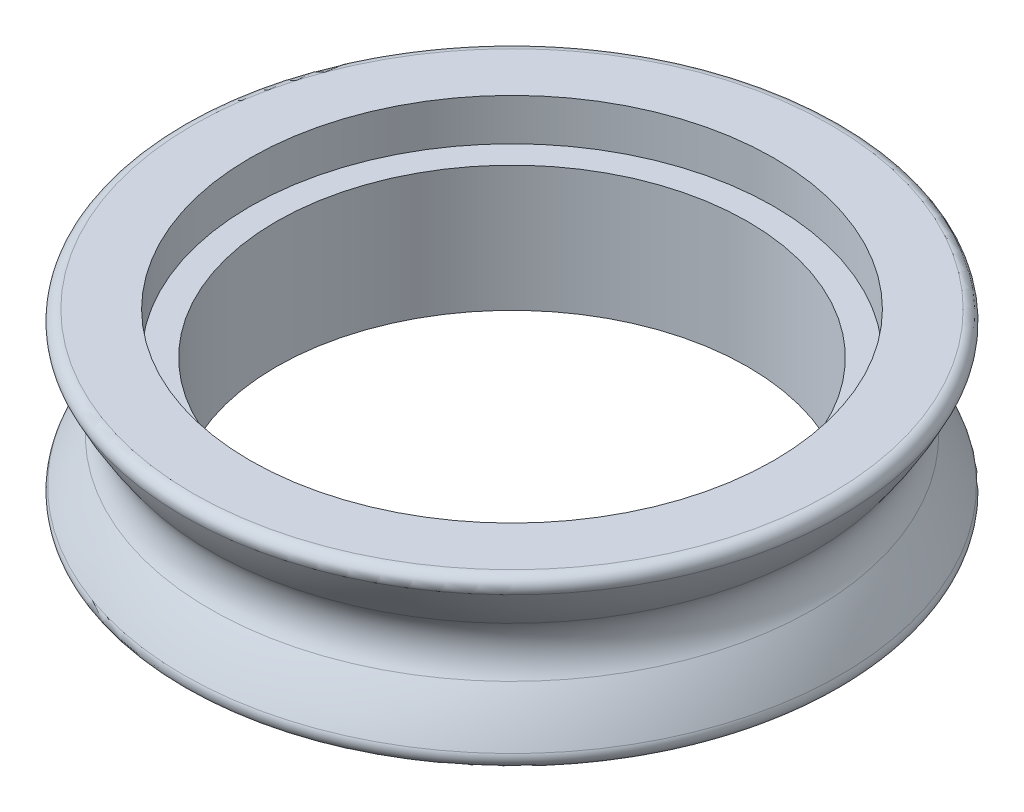
ISO-10303-21;
HEADER;
FILE_DESCRIPTION(('STEP AP214'),'2;1');
FILE_NAME('part.step','',(''),(''),'','','');
FILE_SCHEMA(('AUTOMOTIVE_DESIGN { 1 0 10303 214 1 1 1 1 }'));
ENDSEC;
DATA;
#1=APPLICATION_CONTEXT('core data for automotive mechanical design processes');
#2=APPLICATION_PROTOCOL_DEFINITION('international standard','automotive_design',2000,#1);
#3=PRODUCT_CONTEXT('',#1,'mechanical');
#4=PRODUCT('Part','Part','',(#3));
#5=PRODUCT_RELATED_PRODUCT_CATEGORY('part','',(#4));
#6=PRODUCT_DEFINITION_FORMATION('','',#4);
#7=PRODUCT_DEFINITION_CONTEXT('part definition',#1,'design');
#8=PRODUCT_DEFINITION('design','',#6,#7);
#9=PRODUCT_DEFINITION_SHAPE('','',#8);
#10=(LENGTH_UNIT() NAMED_UNIT(*) SI_UNIT(.MILLI.,.METRE.));
#11=(NAMED_UNIT(*) PLANE_ANGLE_UNIT() SI_UNIT($,.RADIAN.));
#12=(NAMED_UNIT(*) SI_UNIT($,.STERADIAN.) SOLID_ANGLE_UNIT());
#13=UNCERTAINTY_MEASURE_WITH_UNIT(LENGTH_MEASURE(1.E-05),#10,'distance_accuracy_value','');
#14=(GEOMETRIC_REPRESENTATION_CONTEXT(3) GLOBAL_UNCERTAINTY_ASSIGNED_CONTEXT((#13)) GLOBAL_UNIT_ASSIGNED_CONTEXT((#10,
#11,#12)) REPRESENTATION_CONTEXT('',''));
#15=CARTESIAN_POINT('',(0.,0.,0.));
#16=DIRECTION('',(0.,0.,1.));
#17=DIRECTION('',(1.,0.,0.));
#18=AXIS2_PLACEMENT_3D('',#15,#16,#17);
#19=CARTESIAN_POINT('',(0.,5.08,0.));
#20=DIRECTION('',(0.,1.,0.));
#21=DIRECTION('',(0.,0.,1.));
#22=AXIS2_PLACEMENT_3D('',#19,#20,#21);
#23=CYLINDRICAL_SURFACE('',#22,14.2875);
#24=CARTESIAN_POINT('',(0.,-5.08,0.));
#25=DIRECTION('',(0.,1.,0.));
#26=DIRECTION('',(0.,0.,1.));
#27=AXIS2_PLACEMENT_3D('',#24,#25,#26);
#28=CIRCLE('',#27,14.2875);
#29=CARTESIAN_POINT('',(0.,-5.08,14.2875));
#30=VERTEX_POINT('',#29);
#31=EDGE_CURVE('E73',#30,#30,#28,.T.);
#32=ORIENTED_EDGE('',*,*,#31,.F.);
#33=EDGE_LOOP('',(#32));
#34=FACE_BOUND('',#33,.T.);
#35=CARTESIAN_POINT('',(0.,2.54,0.));
#36=DIRECTION('',(0.,1.,0.));
#37=DIRECTION('',(0.,0.,1.));
#38=AXIS2_PLACEMENT_3D('',#35,#36,#37);
#39=CIRCLE('',#38,14.2875);
#40=CARTESIAN_POINT('',(0.,2.54,14.2875));
#41=VERTEX_POINT('',#40);
#42=EDGE_CURVE('E45',#41,#41,#39,.F.);
#43=ORIENTED_EDGE('',*,*,#42,.F.);
#44=EDGE_LOOP('',(#43));
#45=FACE_BOUND('',#44,.T.);
#46=ADVANCED_FACE('F41',(#34,#45),#23,.F.);
#47=CARTESIAN_POINT('',(14.2875,5.08,0.));
#48=DIRECTION('',(0.,-1.,0.));
#49=DIRECTION('',(0.,0.,-1.));
#50=AXIS2_PLACEMENT_3D('',#47,#48,#49);
#51=PLANE('',#50);
#52=CARTESIAN_POINT('',(0.,5.08,0.));
#53=DIRECTION('',(0.,1.,0.));
#54=DIRECTION('',(0.,0.,1.));
#55=AXIS2_PLACEMENT_3D('',#52,#53,#54);
#56=CIRCLE('',#55,15.875);
#57=CARTESIAN_POINT('',(0.,5.08,15.875));
#58=VERTEX_POINT('',#57);
#59=EDGE_CURVE('E77',#58,#58,#56,.T.);
#60=ORIENTED_EDGE('',*,*,#59,.F.);
#61=EDGE_LOOP('',(#60));
#62=FACE_BOUND('',#61,.T.);
#63=CARTESIAN_POINT('',(0.,5.08,0.));
#64=DIRECTION('',(0.,-1.,0.));
#65=DIRECTION('',(0.,0.,-1.));
#66=AXIS2_PLACEMENT_3D('',#63,#64,#65);
#67=CIRCLE('',#66,19.3357146436087);
#68=CARTESIAN_POINT('',(0.,5.08,-19.3357146436087));
#69=VERTEX_POINT('',#68);
#70=EDGE_CURVE('E50',#69,#69,#67,.F.);
#71=ORIENTED_EDGE('',*,*,#70,.T.);
#72=EDGE_LOOP('',(#71));
#73=FACE_BOUND('',#72,.T.);
#74=ADVANCED_FACE('F93',(#62,#73),#51,.F.);
#75=CARTESIAN_POINT('',(14.2875,-5.08,0.));
#76=DIRECTION('',(0.,1.,0.));
#77=DIRECTION('',(0.,0.,1.));
#78=AXIS2_PLACEMENT_3D('',#75,#76,#77);
#79=PLANE('',#78);
#80=CARTESIAN_POINT('',(0.,-5.08,0.));
#81=DIRECTION('',(0.,1.,0.));
#82=DIRECTION('',(0.,0.,1.));
#83=AXIS2_PLACEMENT_3D('',#80,#81,#82);
#84=CIRCLE('',#83,19.3357146436087);
#85=CARTESIAN_POINT('',(0.,-5.08,19.3357146436087));
#86=VERTEX_POINT('',#85);
#87=EDGE_CURVE('E55',#86,#86,#84,.F.);
#88=ORIENTED_EDGE('',*,*,#87,.T.);
#89=EDGE_LOOP('',(#88));
#90=FACE_BOUND('',#89,.T.);
#91=ORIENTED_EDGE('',*,*,#31,.T.);
#92=EDGE_LOOP('',(#91));
#93=FACE_BOUND('',#92,.T.);
#94=ADVANCED_FACE('F99',(#90,#93),#79,.F.);
#95=CARTESIAN_POINT('',(0.,0.,0.));
#96=DIRECTION('',(0.,1.,0.));
#97=DIRECTION('',(0.,0.,1.));
#98=AXIS2_PLACEMENT_3D('',#95,#96,#97);
#99=TOROIDAL_SURFACE('',#98,20.32,2.54);
#100=CARTESIAN_POINT('',(0.,-1.524,0.));
#101=DIRECTION('',(0.,1.,0.));
#102=DIRECTION('',(-1.,0.,0.));
#103=AXIS2_PLACEMENT_3D('',#100,#101,#102);
#104=CIRCLE('',#103,18.288);
#105=CARTESIAN_POINT('',(-18.288,-1.52400000000001,0.));
#106=VERTEX_POINT('',#105);
#107=EDGE_CURVE('E65',#106,#106,#104,.T.);
#108=ORIENTED_EDGE('',*,*,#107,.T.);
#109=EDGE_LOOP('',(#108));
#110=FACE_BOUND('',#109,.T.);
#111=CARTESIAN_POINT('',(0.,1.524,0.));
#112=DIRECTION('',(0.,-1.,0.));
#113=DIRECTION('',(1.,0.,0.));
#114=AXIS2_PLACEMENT_3D('',#111,#112,#113);
#115=CIRCLE('',#114,18.288);
#116=CARTESIAN_POINT('',(18.288,1.524,0.));
#117=VERTEX_POINT('',#116);
#118=EDGE_CURVE('E69',#117,#117,#115,.T.);
#119=ORIENTED_EDGE('',*,*,#118,.T.);
#120=EDGE_LOOP('',(#119));
#121=FACE_BOUND('',#120,.T.);
#122=ADVANCED_FACE('F110',(#110,#121),#99,.F.);
#123=CARTESIAN_POINT('',(0.,-11.43,0.));
#124=DIRECTION('',(0.,1.,0.));
#125=DIRECTION('',(-1.,0.,0.));
#126=AXIS2_PLACEMENT_3D('',#123,#124,#125);
#127=DEGENERATE_TOROIDAL_SURFACE('',#126,5.08,16.51,.T.);
#128=CARTESIAN_POINT('',(0.,-4.1656,0.));
#129=DIRECTION('',(0.,-1.,0.));
#130=DIRECTION('',(0.,0.,-1.));
#131=AXIS2_PLACEMENT_3D('',#128,#129,#130);
#132=CIRCLE('',#131,19.9059432293531);
#133=CARTESIAN_POINT('',(0.,-4.1656,-19.9059432293531));
#134=VERTEX_POINT('',#133);
#135=EDGE_CURVE('E61',#134,#134,#132,.F.);
#136=ORIENTED_EDGE('',*,*,#135,.T.);
#137=EDGE_LOOP('',(#136));
#138=FACE_BOUND('',#137,.T.);
#139=ORIENTED_EDGE('',*,*,#107,.F.);
#140=EDGE_LOOP('',(#139));
#141=FACE_BOUND('',#140,.T.);
#142=ADVANCED_FACE('F106',(#138,#141),#127,.T.);
#143=CARTESIAN_POINT('',(0.,11.43,0.));
#144=DIRECTION('',(0.,1.,0.));
#145=DIRECTION('',(-1.,0.,0.));
#146=AXIS2_PLACEMENT_3D('',#143,#144,#145);
#147=DEGENERATE_TOROIDAL_SURFACE('',#146,5.08,16.51,.T.);
#148=CARTESIAN_POINT('',(0.,4.1656,0.));
#149=DIRECTION('',(0.,1.,0.));
#150=DIRECTION('',(0.,0.,1.));
#151=AXIS2_PLACEMENT_3D('',#148,#149,#150);
#152=CIRCLE('',#151,19.9059432293531);
#153=CARTESIAN_POINT('',(0.,4.1656,19.9059432293531));
#154=VERTEX_POINT('',#153);
#155=EDGE_CURVE('E10',#154,#154,#152,.F.);
#156=ORIENTED_EDGE('',*,*,#155,.T.);
#157=EDGE_LOOP('',(#156));
#158=FACE_BOUND('',#157,.T.);
#159=ORIENTED_EDGE('',*,*,#118,.F.);
#160=EDGE_LOOP('',(#159));
#161=FACE_BOUND('',#160,.T.);
#162=ADVANCED_FACE('F109',(#158,#161),#147,.T.);
#163=CARTESIAN_POINT('',(0.,-4.445,0.));
#164=DIRECTION('',(0.,1.,0.));
#165=DIRECTION('',(0.,0.,1.));
#166=AXIS2_PLACEMENT_3D('',#163,#164,#165);
#167=TOROIDAL_SURFACE('',#166,19.3357146436087,0.635);
#168=ORIENTED_EDGE('',*,*,#87,.F.);
#169=EDGE_LOOP('',(#168));
#170=FACE_BOUND('',#169,.T.);
#171=ORIENTED_EDGE('',*,*,#135,.F.);
#172=EDGE_LOOP('',(#171));
#173=FACE_BOUND('',#172,.T.);
#174=ADVANCED_FACE('F113',(#170,#173),#167,.T.);
#175=CARTESIAN_POINT('',(0.,4.445,0.));
#176=DIRECTION('',(0.,-1.,0.));
#177=DIRECTION('',(0.,0.,-1.));
#178=AXIS2_PLACEMENT_3D('',#175,#176,#177);
#179=TOROIDAL_SURFACE('',#178,19.3357146436087,0.635);
#180=ORIENTED_EDGE('',*,*,#155,.F.);
#181=EDGE_LOOP('',(#180));
#182=FACE_BOUND('',#181,.T.);
#183=ORIENTED_EDGE('',*,*,#70,.F.);
#184=EDGE_LOOP('',(#183));
#185=FACE_BOUND('',#184,.T.);
#186=ADVANCED_FACE('F43',(#182,#185),#179,.T.);
#187=CARTESIAN_POINT('',(0.,2.54,0.));
#188=DIRECTION('',(0.,1.,0.));
#189=DIRECTION('',(0.,0.,1.));
#190=AXIS2_PLACEMENT_3D('',#187,#188,#189);
#191=PLANE('',#190);
#192=CARTESIAN_POINT('',(0.,2.54,0.));
#193=DIRECTION('',(0.,1.,0.));
#194=DIRECTION('',(0.,0.,1.));
#195=AXIS2_PLACEMENT_3D('',#192,#193,#194);
#196=CIRCLE('',#195,15.875);
#197=CARTESIAN_POINT('',(0.,2.54,15.875));
#198=VERTEX_POINT('',#197);
#199=EDGE_CURVE('E81',#198,#198,#196,.T.);
#200=ORIENTED_EDGE('',*,*,#199,.T.);
#201=EDGE_LOOP('',(#200));
#202=FACE_BOUND('',#201,.T.);
#203=ORIENTED_EDGE('',*,*,#42,.T.);
#204=EDGE_LOOP('',(#203));
#205=FACE_BOUND('',#204,.T.);
#206=ADVANCED_FACE('F90',(#202,#205),#191,.T.);
#207=CARTESIAN_POINT('',(0.,2.54,0.));
#208=DIRECTION('',(0.,1.,0.));
#209=DIRECTION('',(0.,0.,1.));
#210=AXIS2_PLACEMENT_3D('',#207,#208,#209);
#211=CYLINDRICAL_SURFACE('',#210,15.875);
#212=ORIENTED_EDGE('',*,*,#199,.F.);
#213=EDGE_LOOP('',(#212));
#214=FACE_BOUND('',#213,.T.);
#215=ORIENTED_EDGE('',*,*,#59,.T.);
#216=EDGE_LOOP('',(#215));
#217=FACE_BOUND('',#216,.T.);
#218=ADVANCED_FACE('F135',(#214,#217),#211,.F.);
#219=CLOSED_SHELL('',(#46,#74,#94,#122,#142,#162,#174,#186,#206,#218));
#220=MANIFOLD_SOLID_BREP('B2',#219);
#221=ADVANCED_BREP_SHAPE_REPRESENTATION('',(#18,#220),#14);
#222=SHAPE_DEFINITION_REPRESENTATION(#9,#221);
ENDSEC;
END-ISO-10303-21;
